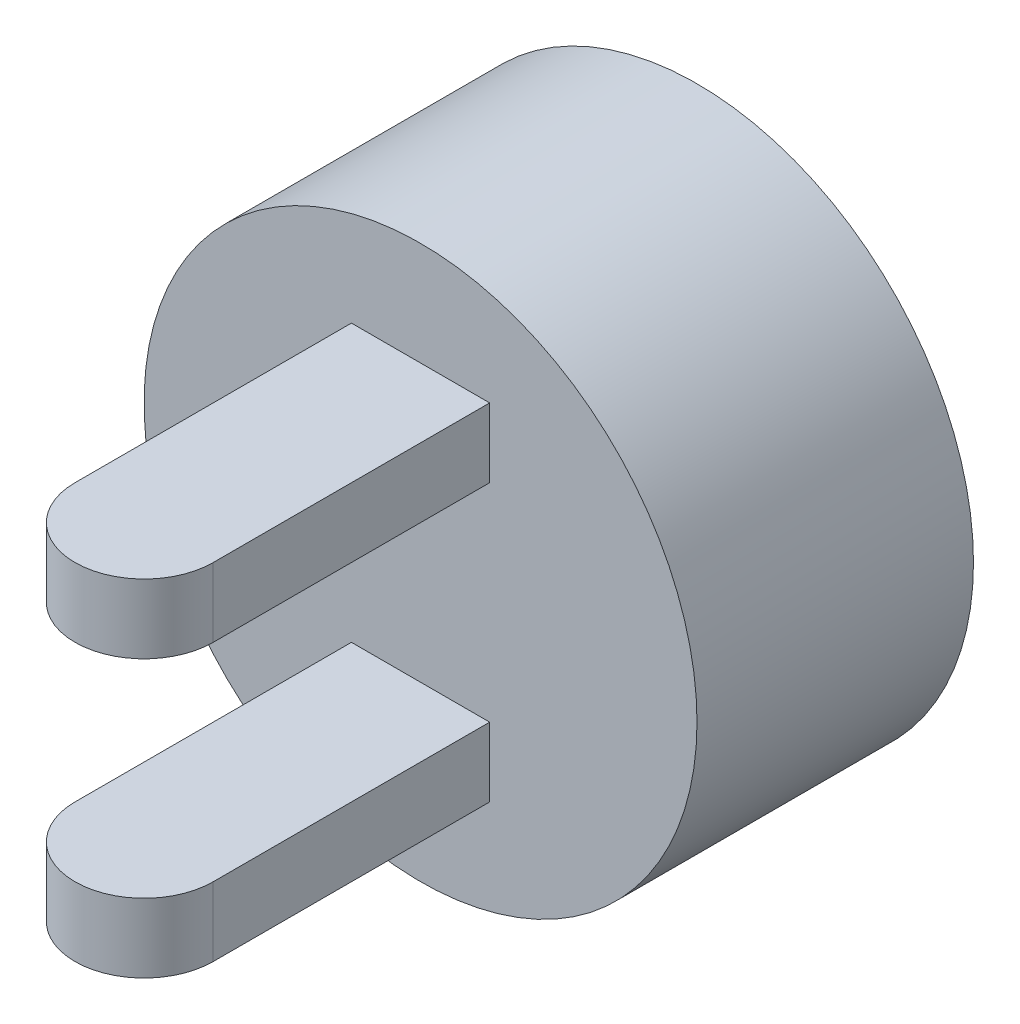
ISO-10303-21;
HEADER;
FILE_DESCRIPTION(('STEP AP214'),'2;1');
FILE_NAME('part.step','',(''),(''),'','','');
FILE_SCHEMA(('AUTOMOTIVE_DESIGN { 1 0 10303 214 1 1 1 1 }'));
ENDSEC;
DATA;
#1=APPLICATION_CONTEXT('core data for automotive mechanical design processes');
#2=APPLICATION_PROTOCOL_DEFINITION('international standard','automotive_design',2000,#1);
#3=PRODUCT_CONTEXT('',#1,'mechanical');
#4=PRODUCT('Part','Part','',(#3));
#5=PRODUCT_RELATED_PRODUCT_CATEGORY('part','',(#4));
#6=PRODUCT_DEFINITION_FORMATION('','',#4);
#7=PRODUCT_DEFINITION_CONTEXT('part definition',#1,'design');
#8=PRODUCT_DEFINITION('design','',#6,#7);
#9=PRODUCT_DEFINITION_SHAPE('','',#8);
#10=(LENGTH_UNIT() NAMED_UNIT(*) SI_UNIT(.MILLI.,.METRE.));
#11=(NAMED_UNIT(*) PLANE_ANGLE_UNIT() SI_UNIT($,.RADIAN.));
#12=(NAMED_UNIT(*) SI_UNIT($,.STERADIAN.) SOLID_ANGLE_UNIT());
#13=UNCERTAINTY_MEASURE_WITH_UNIT(LENGTH_MEASURE(1.E-05),#10,'distance_accuracy_value','');
#14=(GEOMETRIC_REPRESENTATION_CONTEXT(3) GLOBAL_UNCERTAINTY_ASSIGNED_CONTEXT((#13)) GLOBAL_UNIT_ASSIGNED_CONTEXT((#10,
#11,#12)) REPRESENTATION_CONTEXT('',''));
#15=CARTESIAN_POINT('',(0.,0.,0.));
#16=DIRECTION('',(0.,0.,1.));
#17=DIRECTION('',(1.,0.,0.));
#18=AXIS2_PLACEMENT_3D('',#15,#16,#17);
#19=CARTESIAN_POINT('',(0.,0.,200.));
#20=DIRECTION('',(0.,0.,1.));
#21=DIRECTION('',(1.,0.,0.));
#22=AXIS2_PLACEMENT_3D('',#19,#20,#21);
#23=PLANE('',#22);
#24=DIRECTION('',(-1.,0.,0.));
#25=VECTOR('',#24,1.);
#26=CARTESIAN_POINT('',(-50.,125.,200.));
#27=LINE('',#26,#25);
#28=CARTESIAN_POINT('',(50.,125.,200.));
#29=VERTEX_POINT('',#28);
#30=CARTESIAN_POINT('',(-50.,125.,200.));
#31=VERTEX_POINT('',#30);
#32=EDGE_CURVE('E134',#29,#31,#27,.T.);
#33=ORIENTED_EDGE('',*,*,#32,.F.);
#34=DIRECTION('',(0.,-1.,0.));
#35=VECTOR('',#34,1.);
#36=CARTESIAN_POINT('',(50.,125.,200.));
#37=LINE('',#36,#35);
#38=CARTESIAN_POINT('',(50.,75.,200.));
#39=VERTEX_POINT('',#38);
#40=EDGE_CURVE('E144',#29,#39,#37,.T.);
#41=ORIENTED_EDGE('',*,*,#40,.T.);
#42=DIRECTION('',(-1.,0.,0.));
#43=VECTOR('',#42,1.);
#44=CARTESIAN_POINT('',(-50.,75.,200.));
#45=LINE('',#44,#43);
#46=CARTESIAN_POINT('',(-50.,75.,200.));
#47=VERTEX_POINT('',#46);
#48=EDGE_CURVE('E133',#39,#47,#45,.T.);
#49=ORIENTED_EDGE('',*,*,#48,.T.);
#50=DIRECTION('',(0.,-1.,0.));
#51=VECTOR('',#50,1.);
#52=CARTESIAN_POINT('',(-50.,125.,200.));
#53=LINE('',#52,#51);
#54=EDGE_CURVE('E160',#31,#47,#53,.T.);
#55=ORIENTED_EDGE('',*,*,#54,.F.);
#56=EDGE_LOOP('',(#33,#41,#49,#55));
#57=FACE_BOUND('',#56,.T.);
#58=CARTESIAN_POINT('',(0.,0.,200.));
#59=DIRECTION('',(0.,0.,1.));
#60=DIRECTION('',(1.,0.,0.));
#61=AXIS2_PLACEMENT_3D('',#58,#59,#60);
#62=CIRCLE('',#61,200.);
#63=CARTESIAN_POINT('',(200.,0.,200.));
#64=VERTEX_POINT('',#63);
#65=EDGE_CURVE('E11',#64,#64,#62,.T.);
#66=ORIENTED_EDGE('',*,*,#65,.T.);
#67=EDGE_LOOP('',(#66));
#68=FACE_BOUND('',#67,.T.);
#69=DIRECTION('',(0.,1.,0.));
#70=VECTOR('',#69,1.);
#71=CARTESIAN_POINT('',(50.,-125.,200.));
#72=LINE('',#71,#70);
#73=CARTESIAN_POINT('',(50.,-125.,200.));
#74=VERTEX_POINT('',#73);
#75=CARTESIAN_POINT('',(50.,-75.,200.));
#76=VERTEX_POINT('',#75);
#77=EDGE_CURVE('E48',#74,#76,#72,.T.);
#78=ORIENTED_EDGE('',*,*,#77,.F.);
#79=DIRECTION('',(1.,0.,0.));
#80=VECTOR('',#79,1.);
#81=CARTESIAN_POINT('',(-50.,-125.,200.));
#82=LINE('',#81,#80);
#83=CARTESIAN_POINT('',(-50.,-125.,200.));
#84=VERTEX_POINT('',#83);
#85=EDGE_CURVE('E53',#84,#74,#82,.T.);
#86=ORIENTED_EDGE('',*,*,#85,.F.);
#87=DIRECTION('',(0.,1.,0.));
#88=VECTOR('',#87,1.);
#89=CARTESIAN_POINT('',(-50.,-125.,200.));
#90=LINE('',#89,#88);
#91=CARTESIAN_POINT('',(-50.,-75.,200.));
#92=VERTEX_POINT('',#91);
#93=EDGE_CURVE('E118',#84,#92,#90,.T.);
#94=ORIENTED_EDGE('',*,*,#93,.T.);
#95=DIRECTION('',(1.,0.,0.));
#96=VECTOR('',#95,1.);
#97=CARTESIAN_POINT('',(-50.,-75.,200.));
#98=LINE('',#97,#96);
#99=EDGE_CURVE('E122',#92,#76,#98,.T.);
#100=ORIENTED_EDGE('',*,*,#99,.T.);
#101=EDGE_LOOP('',(#78,#86,#94,#100));
#102=FACE_BOUND('',#101,.T.);
#103=ADVANCED_FACE('F33',(#57,#68,#102),#23,.T.);
#104=CARTESIAN_POINT('',(0.,0.,200.));
#105=DIRECTION('',(0.,0.,-1.));
#106=DIRECTION('',(-1.,0.,0.));
#107=AXIS2_PLACEMENT_3D('',#104,#105,#106);
#108=CYLINDRICAL_SURFACE('',#107,200.);
#109=ORIENTED_EDGE('',*,*,#65,.F.);
#110=EDGE_LOOP('',(#109));
#111=FACE_BOUND('',#110,.T.);
#112=CARTESIAN_POINT('',(0.,0.,0.));
#113=DIRECTION('',(0.,0.,1.));
#114=DIRECTION('',(1.,0.,0.));
#115=AXIS2_PLACEMENT_3D('',#112,#113,#114);
#116=CIRCLE('',#115,200.);
#117=CARTESIAN_POINT('',(200.,0.,0.));
#118=VERTEX_POINT('',#117);
#119=EDGE_CURVE('E37',#118,#118,#116,.T.);
#120=ORIENTED_EDGE('',*,*,#119,.T.);
#121=EDGE_LOOP('',(#120));
#122=FACE_BOUND('',#121,.T.);
#123=ADVANCED_FACE('F35',(#111,#122),#108,.T.);
#124=CARTESIAN_POINT('',(0.,0.,0.));
#125=DIRECTION('',(0.,0.,1.));
#126=DIRECTION('',(1.,0.,0.));
#127=AXIS2_PLACEMENT_3D('',#124,#125,#126);
#128=PLANE('',#127);
#129=ORIENTED_EDGE('',*,*,#119,.F.);
#130=EDGE_LOOP('',(#129));
#131=FACE_BOUND('',#130,.T.);
#132=ADVANCED_FACE('F168',(#131),#128,.F.);
#133=CARTESIAN_POINT('',(-50.,125.,200.));
#134=DIRECTION('',(1.,0.,0.));
#135=DIRECTION('',(0.,0.,-1.));
#136=AXIS2_PLACEMENT_3D('',#133,#134,#135);
#137=PLANE('',#136);
#138=DIRECTION('',(0.,0.,1.));
#139=VECTOR('',#138,1.);
#140=CARTESIAN_POINT('',(-50.,75.,200.));
#141=LINE('',#140,#139);
#142=CARTESIAN_POINT('',(-50.,75.,400.));
#143=VERTEX_POINT('',#142);
#144=EDGE_CURVE('E147',#47,#143,#141,.T.);
#145=ORIENTED_EDGE('',*,*,#144,.T.);
#146=DIRECTION('',(0.,-1.,0.));
#147=VECTOR('',#146,1.);
#148=CARTESIAN_POINT('',(-50.,125.,400.));
#149=LINE('',#148,#147);
#150=CARTESIAN_POINT('',(-50.,125.,400.));
#151=VERTEX_POINT('',#150);
#152=EDGE_CURVE('E157',#151,#143,#149,.T.);
#153=ORIENTED_EDGE('',*,*,#152,.F.);
#154=DIRECTION('',(0.,0.,1.));
#155=VECTOR('',#154,1.);
#156=CARTESIAN_POINT('',(-50.,125.,200.));
#157=LINE('',#156,#155);
#158=EDGE_CURVE('E137',#31,#151,#157,.T.);
#159=ORIENTED_EDGE('',*,*,#158,.F.);
#160=ORIENTED_EDGE('',*,*,#54,.T.);
#161=EDGE_LOOP('',(#145,#153,#159,#160));
#162=FACE_BOUND('',#161,.T.);
#163=ADVANCED_FACE('F170',(#162),#137,.F.);
#164=CARTESIAN_POINT('',(0.,125.,400.));
#165=DIRECTION('',(0.,-1.,0.));
#166=DIRECTION('',(0.,0.,-1.));
#167=AXIS2_PLACEMENT_3D('',#164,#165,#166);
#168=CYLINDRICAL_SURFACE('',#167,50.);
#169=CARTESIAN_POINT('',(0.,75.,400.));
#170=DIRECTION('',(0.,1.,0.));
#171=DIRECTION('',(0.,0.,1.));
#172=AXIS2_PLACEMENT_3D('',#169,#170,#171);
#173=CIRCLE('',#172,50.);
#174=CARTESIAN_POINT('',(50.,75.,400.));
#175=VERTEX_POINT('',#174);
#176=EDGE_CURVE('E149',#143,#175,#173,.T.);
#177=ORIENTED_EDGE('',*,*,#176,.T.);
#178=DIRECTION('',(0.,-1.,0.));
#179=VECTOR('',#178,1.);
#180=CARTESIAN_POINT('',(50.,125.,400.));
#181=LINE('',#180,#179);
#182=CARTESIAN_POINT('',(50.,125.,400.));
#183=VERTEX_POINT('',#182);
#184=EDGE_CURVE('E154',#183,#175,#181,.T.);
#185=ORIENTED_EDGE('',*,*,#184,.F.);
#186=CARTESIAN_POINT('',(0.,125.,400.));
#187=DIRECTION('',(0.,1.,0.));
#188=DIRECTION('',(0.,0.,1.));
#189=AXIS2_PLACEMENT_3D('',#186,#187,#188);
#190=CIRCLE('',#189,50.);
#191=EDGE_CURVE('E140',#151,#183,#190,.T.);
#192=ORIENTED_EDGE('',*,*,#191,.F.);
#193=ORIENTED_EDGE('',*,*,#152,.T.);
#194=EDGE_LOOP('',(#177,#185,#192,#193));
#195=FACE_BOUND('',#194,.T.);
#196=ADVANCED_FACE('F175',(#195),#168,.T.);
#197=CARTESIAN_POINT('',(50.,125.,200.));
#198=DIRECTION('',(-1.,0.,0.));
#199=DIRECTION('',(0.,0.,1.));
#200=AXIS2_PLACEMENT_3D('',#197,#198,#199);
#201=PLANE('',#200);
#202=DIRECTION('',(0.,0.,-1.));
#203=VECTOR('',#202,1.);
#204=CARTESIAN_POINT('',(50.,75.,200.));
#205=LINE('',#204,#203);
#206=EDGE_CURVE('E138',#175,#39,#205,.T.);
#207=ORIENTED_EDGE('',*,*,#206,.T.);
#208=ORIENTED_EDGE('',*,*,#40,.F.);
#209=DIRECTION('',(0.,0.,-1.));
#210=VECTOR('',#209,1.);
#211=CARTESIAN_POINT('',(50.,125.,200.));
#212=LINE('',#211,#210);
#213=EDGE_CURVE('E142',#183,#29,#212,.T.);
#214=ORIENTED_EDGE('',*,*,#213,.F.);
#215=ORIENTED_EDGE('',*,*,#184,.T.);
#216=EDGE_LOOP('',(#207,#208,#214,#215));
#217=FACE_BOUND('',#216,.T.);
#218=ADVANCED_FACE('F188',(#217),#201,.F.);
#219=CARTESIAN_POINT('',(0.,125.,400.));
#220=DIRECTION('',(0.,1.,0.));
#221=DIRECTION('',(0.,0.,1.));
#222=AXIS2_PLACEMENT_3D('',#219,#220,#221);
#223=PLANE('',#222);
#224=ORIENTED_EDGE('',*,*,#32,.T.);
#225=ORIENTED_EDGE('',*,*,#158,.T.);
#226=ORIENTED_EDGE('',*,*,#191,.T.);
#227=ORIENTED_EDGE('',*,*,#213,.T.);
#228=EDGE_LOOP('',(#224,#225,#226,#227));
#229=FACE_BOUND('',#228,.T.);
#230=ADVANCED_FACE('F192',(#229),#223,.T.);
#231=CARTESIAN_POINT('',(0.,75.,400.));
#232=DIRECTION('',(0.,1.,0.));
#233=DIRECTION('',(0.,0.,1.));
#234=AXIS2_PLACEMENT_3D('',#231,#232,#233);
#235=PLANE('',#234);
#236=ORIENTED_EDGE('',*,*,#48,.F.);
#237=ORIENTED_EDGE('',*,*,#206,.F.);
#238=ORIENTED_EDGE('',*,*,#176,.F.);
#239=ORIENTED_EDGE('',*,*,#144,.F.);
#240=EDGE_LOOP('',(#236,#237,#238,#239));
#241=FACE_BOUND('',#240,.T.);
#242=ADVANCED_FACE('F194',(#241),#235,.F.);
#243=CARTESIAN_POINT('',(50.,-125.,200.));
#244=DIRECTION('',(-1.,0.,0.));
#245=DIRECTION('',(0.,0.,1.));
#246=AXIS2_PLACEMENT_3D('',#243,#244,#245);
#247=PLANE('',#246);
#248=DIRECTION('',(0.,0.,1.));
#249=VECTOR('',#248,1.);
#250=CARTESIAN_POINT('',(50.,-75.,200.));
#251=LINE('',#250,#249);
#252=CARTESIAN_POINT('',(50.,-75.,400.));
#253=VERTEX_POINT('',#252);
#254=EDGE_CURVE('E109',#76,#253,#251,.T.);
#255=ORIENTED_EDGE('',*,*,#254,.T.);
#256=DIRECTION('',(0.,1.,0.));
#257=VECTOR('',#256,1.);
#258=CARTESIAN_POINT('',(50.,-125.,400.));
#259=LINE('',#258,#257);
#260=CARTESIAN_POINT('',(50.,-125.,400.));
#261=VERTEX_POINT('',#260);
#262=EDGE_CURVE('E106',#261,#253,#259,.T.);
#263=ORIENTED_EDGE('',*,*,#262,.F.);
#264=DIRECTION('',(0.,0.,1.));
#265=VECTOR('',#264,1.);
#266=CARTESIAN_POINT('',(50.,-125.,200.));
#267=LINE('',#266,#265);
#268=EDGE_CURVE('E96',#74,#261,#267,.T.);
#269=ORIENTED_EDGE('',*,*,#268,.F.);
#270=ORIENTED_EDGE('',*,*,#77,.T.);
#271=EDGE_LOOP('',(#255,#263,#269,#270));
#272=FACE_BOUND('',#271,.T.);
#273=ADVANCED_FACE('F107',(#272),#247,.F.);
#274=CARTESIAN_POINT('',(0.,-125.,400.));
#275=DIRECTION('',(0.,1.,0.));
#276=DIRECTION('',(0.,0.,1.));
#277=AXIS2_PLACEMENT_3D('',#274,#275,#276);
#278=CYLINDRICAL_SURFACE('',#277,50.);
#279=CARTESIAN_POINT('',(0.,-75.,400.));
#280=DIRECTION('',(0.,1.,0.));
#281=DIRECTION('',(0.,0.,1.));
#282=AXIS2_PLACEMENT_3D('',#279,#280,#281);
#283=CIRCLE('',#282,50.);
#284=CARTESIAN_POINT('',(-50.,-75.,400.));
#285=VERTEX_POINT('',#284);
#286=EDGE_CURVE('E125',#285,#253,#283,.T.);
#287=ORIENTED_EDGE('',*,*,#286,.F.);
#288=DIRECTION('',(0.,1.,0.));
#289=VECTOR('',#288,1.);
#290=CARTESIAN_POINT('',(-50.,-125.,400.));
#291=LINE('',#290,#289);
#292=CARTESIAN_POINT('',(-50.,-125.,400.));
#293=VERTEX_POINT('',#292);
#294=EDGE_CURVE('E113',#293,#285,#291,.T.);
#295=ORIENTED_EDGE('',*,*,#294,.F.);
#296=CARTESIAN_POINT('',(0.,-125.,400.));
#297=DIRECTION('',(0.,1.,0.));
#298=DIRECTION('',(0.,0.,1.));
#299=AXIS2_PLACEMENT_3D('',#296,#297,#298);
#300=CIRCLE('',#299,50.);
#301=EDGE_CURVE('E101',#293,#261,#300,.T.);
#302=ORIENTED_EDGE('',*,*,#301,.T.);
#303=ORIENTED_EDGE('',*,*,#262,.T.);
#304=EDGE_LOOP('',(#287,#295,#302,#303));
#305=FACE_BOUND('',#304,.T.);
#306=ADVANCED_FACE('F115',(#305),#278,.T.);
#307=CARTESIAN_POINT('',(-50.,-125.,200.));
#308=DIRECTION('',(-1.,0.,0.));
#309=DIRECTION('',(0.,0.,1.));
#310=AXIS2_PLACEMENT_3D('',#307,#308,#309);
#311=PLANE('',#310);
#312=DIRECTION('',(0.,0.,1.));
#313=VECTOR('',#312,1.);
#314=CARTESIAN_POINT('',(-50.,-75.,200.));
#315=LINE('',#314,#313);
#316=EDGE_CURVE('E127',#92,#285,#315,.T.);
#317=ORIENTED_EDGE('',*,*,#316,.F.);
#318=ORIENTED_EDGE('',*,*,#93,.F.);
#319=DIRECTION('',(0.,0.,1.));
#320=VECTOR('',#319,1.);
#321=CARTESIAN_POINT('',(-50.,-125.,200.));
#322=LINE('',#321,#320);
#323=EDGE_CURVE('E116',#84,#293,#322,.T.);
#324=ORIENTED_EDGE('',*,*,#323,.T.);
#325=ORIENTED_EDGE('',*,*,#294,.T.);
#326=EDGE_LOOP('',(#317,#318,#324,#325));
#327=FACE_BOUND('',#326,.T.);
#328=ADVANCED_FACE('F205',(#327),#311,.T.);
#329=CARTESIAN_POINT('',(0.,-125.,400.));
#330=DIRECTION('',(0.,1.,0.));
#331=DIRECTION('',(0.,0.,1.));
#332=AXIS2_PLACEMENT_3D('',#329,#330,#331);
#333=PLANE('',#332);
#334=ORIENTED_EDGE('',*,*,#85,.T.);
#335=ORIENTED_EDGE('',*,*,#268,.T.);
#336=ORIENTED_EDGE('',*,*,#301,.F.);
#337=ORIENTED_EDGE('',*,*,#323,.F.);
#338=EDGE_LOOP('',(#334,#335,#336,#337));
#339=FACE_BOUND('',#338,.T.);
#340=ADVANCED_FACE('F98',(#339),#333,.F.);
#341=CARTESIAN_POINT('',(0.,-75.,400.));
#342=DIRECTION('',(0.,1.,0.));
#343=DIRECTION('',(0.,0.,1.));
#344=AXIS2_PLACEMENT_3D('',#341,#342,#343);
#345=PLANE('',#344);
#346=ORIENTED_EDGE('',*,*,#99,.F.);
#347=ORIENTED_EDGE('',*,*,#316,.T.);
#348=ORIENTED_EDGE('',*,*,#286,.T.);
#349=ORIENTED_EDGE('',*,*,#254,.F.);
#350=EDGE_LOOP('',(#346,#347,#348,#349));
#351=FACE_BOUND('',#350,.T.);
#352=ADVANCED_FACE('F209',(#351),#345,.T.);
#353=CLOSED_SHELL('',(#103,#123,#132,#163,#196,#218,#230,#242,#273,#306,#328,#340,#352));
#354=MANIFOLD_SOLID_BREP('B2',#353);
#355=ADVANCED_BREP_SHAPE_REPRESENTATION('',(#18,#354),#14);
#356=SHAPE_DEFINITION_REPRESENTATION(#9,#355);
ENDSEC;
END-ISO-10303-21;
